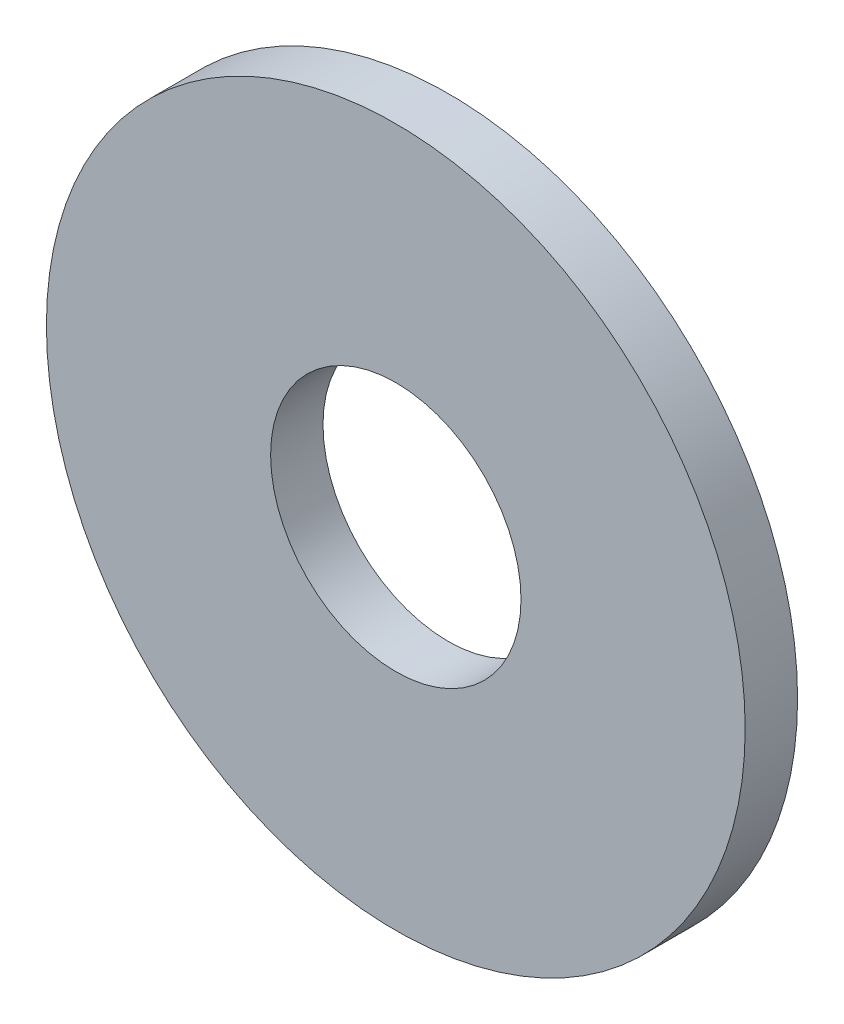
ISO-10303-21;
HEADER;
FILE_DESCRIPTION(('STEP AP214'),'2;1');
FILE_NAME('part.step','',(''),(''),'','','');
FILE_SCHEMA(('AUTOMOTIVE_DESIGN { 1 0 10303 214 1 1 1 1 }'));
ENDSEC;
DATA;
#1=APPLICATION_CONTEXT('core data for automotive mechanical design processes');
#2=APPLICATION_PROTOCOL_DEFINITION('international standard','automotive_design',2000,#1);
#3=PRODUCT_CONTEXT('',#1,'mechanical');
#4=PRODUCT('Part','Part','',(#3));
#5=PRODUCT_RELATED_PRODUCT_CATEGORY('part','',(#4));
#6=PRODUCT_DEFINITION_FORMATION('','',#4);
#7=PRODUCT_DEFINITION_CONTEXT('part definition',#1,'design');
#8=PRODUCT_DEFINITION('design','',#6,#7);
#9=PRODUCT_DEFINITION_SHAPE('','',#8);
#10=(LENGTH_UNIT() NAMED_UNIT(*) SI_UNIT(.MILLI.,.METRE.));
#11=(NAMED_UNIT(*) PLANE_ANGLE_UNIT() SI_UNIT($,.RADIAN.));
#12=(NAMED_UNIT(*) SI_UNIT($,.STERADIAN.) SOLID_ANGLE_UNIT());
#13=UNCERTAINTY_MEASURE_WITH_UNIT(LENGTH_MEASURE(1.E-05),#10,'distance_accuracy_value','');
#14=(GEOMETRIC_REPRESENTATION_CONTEXT(3) GLOBAL_UNCERTAINTY_ASSIGNED_CONTEXT((#13)) GLOBAL_UNIT_ASSIGNED_CONTEXT((#10,
#11,#12)) REPRESENTATION_CONTEXT('',''));
#15=CARTESIAN_POINT('',(0.,0.,0.));
#16=DIRECTION('',(0.,0.,1.));
#17=DIRECTION('',(1.,0.,0.));
#18=AXIS2_PLACEMENT_3D('',#15,#16,#17);
#19=CARTESIAN_POINT('',(0.,0.,0.));
#20=DIRECTION('',(0.,0.,1.));
#21=DIRECTION('',(1.,0.,0.));
#22=AXIS2_PLACEMENT_3D('',#19,#20,#21);
#23=PLANE('',#22);
#24=CARTESIAN_POINT('',(0.,0.,0.));
#25=DIRECTION('',(0.,0.,1.));
#26=DIRECTION('',(1.,0.,0.));
#27=AXIS2_PLACEMENT_3D('',#24,#25,#26);
#28=CIRCLE('',#27,2.15);
#29=CARTESIAN_POINT('',(2.15,0.,0.));
#30=VERTEX_POINT('',#29);
#31=EDGE_CURVE('E27',#30,#30,#28,.F.);
#32=ORIENTED_EDGE('',*,*,#31,.T.);
#33=EDGE_LOOP('',(#32));
#34=FACE_BOUND('',#33,.T.);
#35=CARTESIAN_POINT('',(0.,0.,0.));
#36=DIRECTION('',(0.,0.,1.));
#37=DIRECTION('',(1.,0.,0.));
#38=AXIS2_PLACEMENT_3D('',#35,#36,#37);
#39=CIRCLE('',#38,6.00000000000001);
#40=CARTESIAN_POINT('',(6.00000000000001,0.,0.));
#41=VERTEX_POINT('',#40);
#42=EDGE_CURVE('E18',#41,#41,#39,.F.);
#43=ORIENTED_EDGE('',*,*,#42,.F.);
#44=EDGE_LOOP('',(#43));
#45=FACE_BOUND('',#44,.T.);
#46=ADVANCED_FACE('F15',(#34,#45),#23,.T.);
#47=CARTESIAN_POINT('',(0.,0.,-0.899999999999998));
#48=DIRECTION('',(0.,0.,1.));
#49=DIRECTION('',(1.,0.,0.));
#50=AXIS2_PLACEMENT_3D('',#47,#48,#49);
#51=CYLINDRICAL_SURFACE('',#50,6.00000000000001);
#52=ORIENTED_EDGE('',*,*,#42,.T.);
#53=EDGE_LOOP('',(#52));
#54=FACE_BOUND('',#53,.T.);
#55=CARTESIAN_POINT('',(0.,0.,-0.899999999999998));
#56=DIRECTION('',(0.,0.,1.));
#57=DIRECTION('',(1.,0.,0.));
#58=AXIS2_PLACEMENT_3D('',#55,#56,#57);
#59=CIRCLE('',#58,6.00000000000001);
#60=CARTESIAN_POINT('',(6.00000000000001,0.,-0.899999999999998));
#61=VERTEX_POINT('',#60);
#62=EDGE_CURVE('E22',#61,#61,#59,.T.);
#63=ORIENTED_EDGE('',*,*,#62,.T.);
#64=EDGE_LOOP('',(#63));
#65=FACE_BOUND('',#64,.T.);
#66=ADVANCED_FACE('F35',(#54,#65),#51,.T.);
#67=CARTESIAN_POINT('',(0.,0.,-0.899999999999998));
#68=DIRECTION('',(0.,0.,1.));
#69=DIRECTION('',(1.,0.,0.));
#70=AXIS2_PLACEMENT_3D('',#67,#68,#69);
#71=CYLINDRICAL_SURFACE('',#70,2.15);
#72=ORIENTED_EDGE('',*,*,#31,.F.);
#73=EDGE_LOOP('',(#72));
#74=FACE_BOUND('',#73,.T.);
#75=CARTESIAN_POINT('',(0.,0.,-0.899999999999998));
#76=DIRECTION('',(0.,0.,1.));
#77=DIRECTION('',(1.,0.,0.));
#78=AXIS2_PLACEMENT_3D('',#75,#76,#77);
#79=CIRCLE('',#78,2.15);
#80=CARTESIAN_POINT('',(2.15,0.,-0.899999999999998));
#81=VERTEX_POINT('',#80);
#82=EDGE_CURVE('E10',#81,#81,#79,.F.);
#83=ORIENTED_EDGE('',*,*,#82,.T.);
#84=EDGE_LOOP('',(#83));
#85=FACE_BOUND('',#84,.T.);
#86=ADVANCED_FACE('F43',(#74,#85),#71,.F.);
#87=CARTESIAN_POINT('',(0.,0.,-0.899999999999998));
#88=DIRECTION('',(0.,0.,1.));
#89=DIRECTION('',(1.,0.,0.));
#90=AXIS2_PLACEMENT_3D('',#87,#88,#89);
#91=PLANE('',#90);
#92=ORIENTED_EDGE('',*,*,#82,.F.);
#93=EDGE_LOOP('',(#92));
#94=FACE_BOUND('',#93,.T.);
#95=ORIENTED_EDGE('',*,*,#62,.F.);
#96=EDGE_LOOP('',(#95));
#97=FACE_BOUND('',#96,.T.);
#98=ADVANCED_FACE('F44',(#94,#97),#91,.F.);
#99=CLOSED_SHELL('',(#46,#66,#86,#98));
#100=MANIFOLD_SOLID_BREP('B1',#99);
#101=ADVANCED_BREP_SHAPE_REPRESENTATION('',(#18,#100),#14);
#102=SHAPE_DEFINITION_REPRESENTATION(#9,#101);
ENDSEC;
END-ISO-10303-21;
